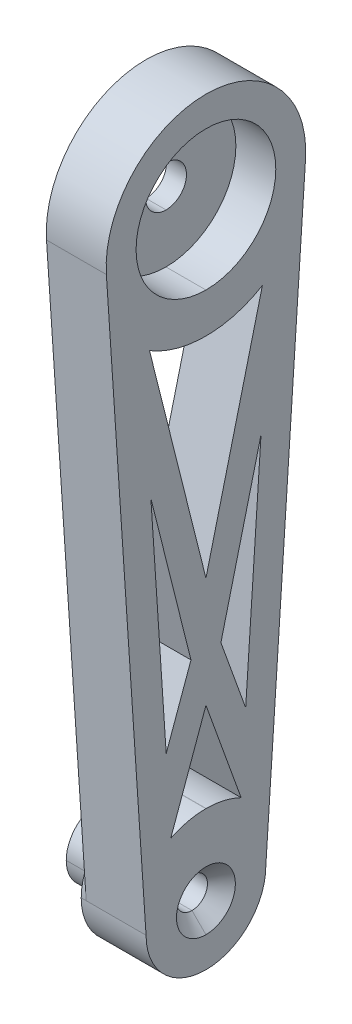
ISO-10303-21;
HEADER;
FILE_DESCRIPTION(('STEP AP214'),'2;1');
FILE_NAME('part.step','',(''),(''),'','','');
FILE_SCHEMA(('AUTOMOTIVE_DESIGN { 1 0 10303 214 1 1 1 1 }'));
ENDSEC;
DATA;
#1=APPLICATION_CONTEXT('core data for automotive mechanical design processes');
#2=APPLICATION_PROTOCOL_DEFINITION('international standard','automotive_design',2000,#1);
#3=PRODUCT_CONTEXT('',#1,'mechanical');
#4=PRODUCT('Part','Part','',(#3));
#5=PRODUCT_RELATED_PRODUCT_CATEGORY('part','',(#4));
#6=PRODUCT_DEFINITION_FORMATION('','',#4);
#7=PRODUCT_DEFINITION_CONTEXT('part definition',#1,'design');
#8=PRODUCT_DEFINITION('design','',#6,#7);
#9=PRODUCT_DEFINITION_SHAPE('','',#8);
#10=(LENGTH_UNIT() NAMED_UNIT(*) SI_UNIT(.MILLI.,.METRE.));
#11=(NAMED_UNIT(*) PLANE_ANGLE_UNIT() SI_UNIT($,.RADIAN.));
#12=(NAMED_UNIT(*) SI_UNIT($,.STERADIAN.) SOLID_ANGLE_UNIT());
#13=UNCERTAINTY_MEASURE_WITH_UNIT(LENGTH_MEASURE(1.E-05),#10,'distance_accuracy_value','');
#14=(GEOMETRIC_REPRESENTATION_CONTEXT(3) GLOBAL_UNCERTAINTY_ASSIGNED_CONTEXT((#13)) GLOBAL_UNIT_ASSIGNED_CONTEXT((#10,
#11,#12)) REPRESENTATION_CONTEXT('',''));
#15=CARTESIAN_POINT('',(0.,0.,0.));
#16=DIRECTION('',(0.,0.,1.));
#17=DIRECTION('',(1.,0.,0.));
#18=AXIS2_PLACEMENT_3D('',#15,#16,#17);
#19=CARTESIAN_POINT('',(0.,0.,0.));
#20=DIRECTION('',(1.,0.,0.));
#21=DIRECTION('',(0.,-1.,0.));
#22=AXIS2_PLACEMENT_3D('',#19,#20,#21);
#23=PLANE('',#22);
#24=DIRECTION('',(0.,-0.997760313354357,-0.066890635331231));
#25=VECTOR('',#24,1.);
#26=CARTESIAN_POINT('',(0.,-0.66890635331231,9.97760313354357));
#27=LINE('',#26,#25);
#28=CARTESIAN_POINT('',(0.,-0.668906353312309,9.97760313354357));
#29=VERTEX_POINT('',#28);
#30=CARTESIAN_POINT('',(0.,-60.,6.));
#31=VERTEX_POINT('',#30);
#32=EDGE_CURVE('E240',#29,#31,#27,.T.);
#33=ORIENTED_EDGE('',*,*,#32,.F.);
#34=CARTESIAN_POINT('',(0.,0.,0.));
#35=DIRECTION('',(1.,0.,0.));
#36=DIRECTION('',(0.,-0.066890635331231,-0.997760313354357));
#37=AXIS2_PLACEMENT_3D('',#34,#35,#36);
#38=CIRCLE('',#37,10.);
#39=CARTESIAN_POINT('',(0.,-0.668906353312309,-9.97760313354357));
#40=VERTEX_POINT('',#39);
#41=EDGE_CURVE('E36',#40,#29,#38,.T.);
#42=ORIENTED_EDGE('',*,*,#41,.F.);
#43=DIRECTION('',(0.,0.997760313354357,-0.066890635331231));
#44=VECTOR('',#43,1.);
#45=CARTESIAN_POINT('',(0.,-60.,-6.));
#46=LINE('',#45,#44);
#47=CARTESIAN_POINT('',(0.,-60.,-6.));
#48=VERTEX_POINT('',#47);
#49=EDGE_CURVE('E341',#48,#40,#46,.T.);
#50=ORIENTED_EDGE('',*,*,#49,.F.);
#51=CARTESIAN_POINT('',(0.,-60.,0.));
#52=DIRECTION('',(-1.,0.,0.));
#53=DIRECTION('',(0.,0.,1.));
#54=AXIS2_PLACEMENT_3D('',#51,#52,#53);
#55=CIRCLE('',#54,6.);
#56=EDGE_CURVE('E403',#31,#48,#55,.T.);
#57=ORIENTED_EDGE('',*,*,#56,.F.);
#58=EDGE_LOOP('',(#33,#42,#50,#57));
#59=FACE_BOUND('',#58,.T.);
#60=DIRECTION('',(0.,-0.997760313354357,-0.0668906353312315));
#61=VECTOR('',#60,1.);
#62=CARTESIAN_POINT('',(0.,-22.3170450758809,5.51956076268863));
#63=LINE('',#62,#61);
#64=CARTESIAN_POINT('',(0.,-22.3170450758809,5.51956076268863));
#65=VERTEX_POINT('',#64);
#66=CARTESIAN_POINT('',(0.,-45.2413588281912,3.98269675747546));
#67=VERTEX_POINT('',#66);
#68=EDGE_CURVE('E11',#65,#67,#63,.T.);
#69=ORIENTED_EDGE('',*,*,#68,.T.);
#70=DIRECTION('',(0.,0.940725836999394,-0.339167951908474));
#71=VECTOR('',#70,1.);
#72=CARTESIAN_POINT('',(0.,-45.2413588281912,3.98269675747546));
#73=LINE('',#72,#71);
#74=CARTESIAN_POINT('',(0.,-38.3552807891257,1.5));
#75=VERTEX_POINT('',#74);
#76=EDGE_CURVE('E27',#67,#75,#73,.T.);
#77=ORIENTED_EDGE('',*,*,#76,.T.);
#78=DIRECTION('',(0.,0.97,0.243104915622865));
#79=VECTOR('',#78,1.);
#80=CARTESIAN_POINT('',(0.,-38.3552807891257,1.5));
#81=LINE('',#80,#79);
#82=EDGE_CURVE('E174',#75,#65,#81,.T.);
#83=ORIENTED_EDGE('',*,*,#82,.T.);
#84=EDGE_LOOP('',(#69,#77,#83));
#85=FACE_BOUND('',#84,.T.);
#86=DIRECTION('',(0.,-0.940725836999394,0.339167951908474));
#87=VECTOR('',#86,1.);
#88=CARTESIAN_POINT('',(0.,-43.0400136347858,0.));
#89=LINE('',#88,#87);
#90=CARTESIAN_POINT('',(0.,-43.0400136347858,0.));
#91=VERTEX_POINT('',#90);
#92=CARTESIAN_POINT('',(0.,-52.8187744648712,3.52562048632773));
#93=VERTEX_POINT('',#92);
#94=EDGE_CURVE('E284',#91,#93,#89,.T.);
#95=ORIENTED_EDGE('',*,*,#94,.T.);
#96=CARTESIAN_POINT('',(0.,-60.,0.));
#97=DIRECTION('',(1.,0.,0.));
#98=DIRECTION('',(0.,0.99999846833785,0.00175023482841359));
#99=AXIS2_PLACEMENT_3D('',#96,#97,#98);
#100=CIRCLE('',#99,7.99999999999991);
#101=CARTESIAN_POINT('',(0.,-52.0000122532972,0.014001878627327));
#102=VERTEX_POINT('',#101);
#103=EDGE_CURVE('E181',#102,#93,#100,.T.);
#104=ORIENTED_EDGE('',*,*,#103,.F.);
#105=DIRECTION('',(0.,0.,-1.));
#106=VECTOR('',#105,1.);
#107=CARTESIAN_POINT('',(0.,-52.0000122532972,0.0140018786273255));
#108=LINE('',#107,#106);
#109=CARTESIAN_POINT('',(0.,-52.0000122532972,-0.014001878627331));
#110=VERTEX_POINT('',#109);
#111=EDGE_CURVE('E281',#102,#110,#108,.T.);
#112=ORIENTED_EDGE('',*,*,#111,.T.);
#113=CARTESIAN_POINT('',(0.,-60.,0.));
#114=DIRECTION('',(1.,0.,0.));
#115=DIRECTION('',(0.,0.897653191891106,-0.44070256079096));
#116=AXIS2_PLACEMENT_3D('',#113,#114,#115);
#117=CIRCLE('',#116,8.00000000000024);
#118=CARTESIAN_POINT('',(0.,-52.8187744648712,-3.52562048632773));
#119=VERTEX_POINT('',#118);
#120=EDGE_CURVE('E340',#119,#110,#117,.T.);
#121=ORIENTED_EDGE('',*,*,#120,.F.);
#122=DIRECTION('',(0.,0.940725836999394,0.339167951908474));
#123=VECTOR('',#122,1.);
#124=CARTESIAN_POINT('',(0.,-52.8187744648712,-3.52562048632773));
#125=LINE('',#124,#123);
#126=EDGE_CURVE('E285',#119,#91,#125,.T.);
#127=ORIENTED_EDGE('',*,*,#126,.T.);
#128=EDGE_LOOP('',(#95,#104,#112,#121,#127));
#129=FACE_BOUND('',#128,.T.);
#130=DIRECTION('',(0.,-0.940725836999394,-0.339167951908474));
#131=VECTOR('',#130,1.);
#132=CARTESIAN_POINT('',(0.,-38.3552807891257,-1.5));
#133=LINE('',#132,#131);
#134=CARTESIAN_POINT('',(0.,-38.3552807891257,-1.5));
#135=VERTEX_POINT('',#134);
#136=CARTESIAN_POINT('',(0.,-45.2413588281912,-3.98269675747546));
#137=VERTEX_POINT('',#136);
#138=EDGE_CURVE('E395',#135,#137,#133,.T.);
#139=ORIENTED_EDGE('',*,*,#138,.T.);
#140=DIRECTION('',(0.,0.997760313354357,-0.0668906353312315));
#141=VECTOR('',#140,1.);
#142=CARTESIAN_POINT('',(0.,-45.2413588281912,-3.98269675747546));
#143=LINE('',#142,#141);
#144=CARTESIAN_POINT('',(0.,-22.3170450758809,-5.51956076268863));
#145=VERTEX_POINT('',#144);
#146=EDGE_CURVE('E399',#137,#145,#143,.T.);
#147=ORIENTED_EDGE('',*,*,#146,.T.);
#148=DIRECTION('',(0.,-0.97,0.243104915622865));
#149=VECTOR('',#148,1.);
#150=CARTESIAN_POINT('',(0.,-22.3170450758809,-5.51956076268863));
#151=LINE('',#150,#149);
#152=EDGE_CURVE('E318',#145,#135,#151,.T.);
#153=ORIENTED_EDGE('',*,*,#152,.T.);
#154=EDGE_LOOP('',(#139,#147,#153));
#155=FACE_BOUND('',#154,.T.);
#156=DIRECTION('',(0.,-0.97,-0.243104915622865));
#157=VECTOR('',#156,1.);
#158=CARTESIAN_POINT('',(0.,-9.43488195511979,5.65535166837173));
#159=LINE('',#158,#157);
#160=CARTESIAN_POINT('',(0.,-9.43488195511979,5.65535166837173));
#161=VERTEX_POINT('',#160);
#162=CARTESIAN_POINT('',(0.,-32.,0.));
#163=VERTEX_POINT('',#162);
#164=EDGE_CURVE('E314',#161,#163,#159,.T.);
#165=ORIENTED_EDGE('',*,*,#164,.T.);
#166=DIRECTION('',(0.,0.97,-0.243104915622865));
#167=VECTOR('',#166,1.);
#168=CARTESIAN_POINT('',(0.,-32.,0.));
#169=LINE('',#168,#167);
#170=CARTESIAN_POINT('',(0.,-9.43488195511979,-5.65535166837173));
#171=VERTEX_POINT('',#170);
#172=EDGE_CURVE('E245',#163,#171,#169,.T.);
#173=ORIENTED_EDGE('',*,*,#172,.T.);
#174=CARTESIAN_POINT('',(0.,0.,0.));
#175=DIRECTION('',(1.,0.,0.));
#176=DIRECTION('',(0.,-0.857716541374527,0.514122878942885));
#177=AXIS2_PLACEMENT_3D('',#174,#175,#176);
#178=CIRCLE('',#177,11.);
#179=EDGE_CURVE('E276',#161,#171,#178,.T.);
#180=ORIENTED_EDGE('',*,*,#179,.F.);
#181=EDGE_LOOP('',(#165,#173,#180));
#182=FACE_BOUND('',#181,.T.);
#183=CARTESIAN_POINT('',(0.,0.,0.));
#184=DIRECTION('',(-1.,0.,0.));
#185=DIRECTION('',(0.,1.,0.));
#186=AXIS2_PLACEMENT_3D('',#183,#184,#185);
#187=CIRCLE('',#186,2.05);
#188=CARTESIAN_POINT('',(0.,2.05,0.));
#189=VERTEX_POINT('',#188);
#190=CARTESIAN_POINT('',(0.,-2.05,0.));
#191=VERTEX_POINT('',#190);
#192=EDGE_CURVE('E280',#189,#191,#187,.T.);
#193=ORIENTED_EDGE('',*,*,#192,.F.);
#194=CARTESIAN_POINT('',(0.,0.,0.));
#195=DIRECTION('',(-1.,0.,0.));
#196=DIRECTION('',(0.,-1.,0.));
#197=AXIS2_PLACEMENT_3D('',#194,#195,#196);
#198=CIRCLE('',#197,2.05);
#199=EDGE_CURVE('E406',#191,#189,#198,.T.);
#200=ORIENTED_EDGE('',*,*,#199,.F.);
#201=EDGE_LOOP('',(#193,#200));
#202=FACE_BOUND('',#201,.T.);
#203=ADVANCED_FACE('F16',(#59,#85,#129,#155,#182,#202),#23,.F.);
#204=CARTESIAN_POINT('',(0.,-0.668906353312309,9.97760313354357));
#205=DIRECTION('',(0.,-0.066890635331231,0.997760313354357));
#206=DIRECTION('',(0.,-0.997760313354357,-0.066890635331231));
#207=AXIS2_PLACEMENT_3D('',#204,#205,#206);
#208=PLANE('',#207);
#209=DIRECTION('',(1.,0.,0.));
#210=VECTOR('',#209,1.);
#211=CARTESIAN_POINT('',(0.,-60.,6.));
#212=LINE('',#211,#210);
#213=CARTESIAN_POINT('',(6.,-60.,6.));
#214=VERTEX_POINT('',#213);
#215=EDGE_CURVE('E238',#31,#214,#212,.T.);
#216=ORIENTED_EDGE('',*,*,#215,.T.);
#217=DIRECTION('',(0.,-0.997760313354357,-0.066890635331231));
#218=VECTOR('',#217,1.);
#219=CARTESIAN_POINT('',(6.,-0.66890635331231,9.97760313354357));
#220=LINE('',#219,#218);
#221=CARTESIAN_POINT('',(6.,-0.668906353312309,9.97760313354357));
#222=VERTEX_POINT('',#221);
#223=EDGE_CURVE('E225',#222,#214,#220,.T.);
#224=ORIENTED_EDGE('',*,*,#223,.F.);
#225=DIRECTION('',(1.,0.,0.));
#226=VECTOR('',#225,1.);
#227=CARTESIAN_POINT('',(0.,-0.668906353312309,9.97760313354357));
#228=LINE('',#227,#226);
#229=EDGE_CURVE('E294',#29,#222,#228,.T.);
#230=ORIENTED_EDGE('',*,*,#229,.F.);
#231=ORIENTED_EDGE('',*,*,#32,.T.);
#232=EDGE_LOOP('',(#216,#224,#230,#231));
#233=FACE_BOUND('',#232,.T.);
#234=ADVANCED_FACE('F239',(#233),#208,.T.);
#235=CARTESIAN_POINT('',(0.,0.,0.));
#236=DIRECTION('',(-1.,0.,0.));
#237=DIRECTION('',(0.,-1.,0.));
#238=AXIS2_PLACEMENT_3D('',#235,#236,#237);
#239=CYLINDRICAL_SURFACE('',#238,10.);
#240=ORIENTED_EDGE('',*,*,#229,.T.);
#241=CARTESIAN_POINT('',(6.,0.,0.));
#242=DIRECTION('',(1.,0.,0.));
#243=DIRECTION('',(0.,-0.066890635331231,-0.997760313354357));
#244=AXIS2_PLACEMENT_3D('',#241,#242,#243);
#245=CIRCLE('',#244,10.);
#246=CARTESIAN_POINT('',(6.,-0.668906353312309,-9.97760313354357));
#247=VERTEX_POINT('',#246);
#248=EDGE_CURVE('E231',#247,#222,#245,.T.);
#249=ORIENTED_EDGE('',*,*,#248,.F.);
#250=DIRECTION('',(1.,0.,0.));
#251=VECTOR('',#250,1.);
#252=CARTESIAN_POINT('',(0.,-0.668906353312309,-9.97760313354357));
#253=LINE('',#252,#251);
#254=EDGE_CURVE('E344',#40,#247,#253,.T.);
#255=ORIENTED_EDGE('',*,*,#254,.F.);
#256=ORIENTED_EDGE('',*,*,#41,.T.);
#257=EDGE_LOOP('',(#240,#249,#255,#256));
#258=FACE_BOUND('',#257,.T.);
#259=ADVANCED_FACE('F584',(#258),#239,.T.);
#260=CARTESIAN_POINT('',(0.,-60.,-6.));
#261=DIRECTION('',(0.,-0.066890635331231,-0.997760313354357));
#262=DIRECTION('',(0.,0.997760313354357,-0.066890635331231));
#263=AXIS2_PLACEMENT_3D('',#260,#261,#262);
#264=PLANE('',#263);
#265=ORIENTED_EDGE('',*,*,#254,.T.);
#266=DIRECTION('',(0.,0.997760313354357,-0.066890635331231));
#267=VECTOR('',#266,1.);
#268=CARTESIAN_POINT('',(6.,-60.,-6.));
#269=LINE('',#268,#267);
#270=CARTESIAN_POINT('',(6.,-60.,-6.));
#271=VERTEX_POINT('',#270);
#272=EDGE_CURVE('E252',#271,#247,#269,.T.);
#273=ORIENTED_EDGE('',*,*,#272,.F.);
#274=DIRECTION('',(1.,0.,0.));
#275=VECTOR('',#274,1.);
#276=CARTESIAN_POINT('',(0.,-60.,-6.));
#277=LINE('',#276,#275);
#278=EDGE_CURVE('E250',#48,#271,#277,.T.);
#279=ORIENTED_EDGE('',*,*,#278,.F.);
#280=ORIENTED_EDGE('',*,*,#49,.T.);
#281=EDGE_LOOP('',(#265,#273,#279,#280));
#282=FACE_BOUND('',#281,.T.);
#283=ADVANCED_FACE('F582',(#282),#264,.T.);
#284=CARTESIAN_POINT('',(0.,-60.,0.));
#285=DIRECTION('',(1.,0.,0.));
#286=DIRECTION('',(0.,0.,-1.));
#287=AXIS2_PLACEMENT_3D('',#284,#285,#286);
#288=CYLINDRICAL_SURFACE('',#287,6.);
#289=DIRECTION('',(-1.,0.,0.));
#290=VECTOR('',#289,1.);
#291=CARTESIAN_POINT('',(0.,-60.,-6.));
#292=LINE('',#291,#290);
#293=CARTESIAN_POINT('',(-0.5,-60.,-6.));
#294=VERTEX_POINT('',#293);
#295=EDGE_CURVE('E345',#48,#294,#292,.T.);
#296=ORIENTED_EDGE('',*,*,#295,.T.);
#297=CARTESIAN_POINT('',(-0.5,-60.,0.));
#298=DIRECTION('',(-1.,0.,0.));
#299=DIRECTION('',(0.,0.,1.));
#300=AXIS2_PLACEMENT_3D('',#297,#298,#299);
#301=CIRCLE('',#300,6.);
#302=CARTESIAN_POINT('',(-0.5,-60.,6.));
#303=VERTEX_POINT('',#302);
#304=EDGE_CURVE('E258',#303,#294,#301,.T.);
#305=ORIENTED_EDGE('',*,*,#304,.F.);
#306=DIRECTION('',(-1.,0.,0.));
#307=VECTOR('',#306,1.);
#308=CARTESIAN_POINT('',(0.,-60.,6.));
#309=LINE('',#308,#307);
#310=EDGE_CURVE('E324',#31,#303,#309,.T.);
#311=ORIENTED_EDGE('',*,*,#310,.F.);
#312=ORIENTED_EDGE('',*,*,#56,.T.);
#313=EDGE_LOOP('',(#296,#305,#311,#312));
#314=FACE_BOUND('',#313,.T.);
#315=ADVANCED_FACE('F592',(#314),#288,.T.);
#316=CARTESIAN_POINT('',(6.,-22.3170450758809,5.51956076268863));
#317=DIRECTION('',(0.,-0.0668906353312315,0.997760313354357));
#318=DIRECTION('',(0.,-0.997760313354357,-0.0668906353312315));
#319=AXIS2_PLACEMENT_3D('',#316,#317,#318);
#320=PLANE('',#319);
#321=DIRECTION('',(-1.,0.,0.));
#322=VECTOR('',#321,1.);
#323=CARTESIAN_POINT('',(6.,-22.3170450758809,5.51956076268863));
#324=LINE('',#323,#322);
#325=CARTESIAN_POINT('',(6.,-22.3170450758809,5.51956076268863));
#326=VERTEX_POINT('',#325);
#327=EDGE_CURVE('E275',#326,#65,#324,.T.);
#328=ORIENTED_EDGE('',*,*,#327,.F.);
#329=DIRECTION('',(0.,-0.997760313354357,-0.0668906353312315));
#330=VECTOR('',#329,1.);
#331=CARTESIAN_POINT('',(6.,-22.3170450758809,5.51956076268863));
#332=LINE('',#331,#330);
#333=CARTESIAN_POINT('',(6.,-45.2413588281912,3.98269675747546));
#334=VERTEX_POINT('',#333);
#335=EDGE_CURVE('E409',#326,#334,#332,.T.);
#336=ORIENTED_EDGE('',*,*,#335,.T.);
#337=DIRECTION('',(-1.,0.,0.));
#338=VECTOR('',#337,1.);
#339=CARTESIAN_POINT('',(6.,-45.2413588281912,3.98269675747546));
#340=LINE('',#339,#338);
#341=EDGE_CURVE('E383',#334,#67,#340,.T.);
#342=ORIENTED_EDGE('',*,*,#341,.T.);
#343=ORIENTED_EDGE('',*,*,#68,.F.);
#344=EDGE_LOOP('',(#328,#336,#342,#343));
#345=FACE_BOUND('',#344,.T.);
#346=ADVANCED_FACE('F664',(#345),#320,.F.);
#347=CARTESIAN_POINT('',(6.,-45.2413588281912,3.98269675747546));
#348=DIRECTION('',(0.,-0.339167951908474,-0.940725836999394));
#349=DIRECTION('',(0.,0.940725836999394,-0.339167951908474));
#350=AXIS2_PLACEMENT_3D('',#347,#348,#349);
#351=PLANE('',#350);
#352=ORIENTED_EDGE('',*,*,#341,.F.);
#353=DIRECTION('',(0.,0.940725836999394,-0.339167951908474));
#354=VECTOR('',#353,1.);
#355=CARTESIAN_POINT('',(6.,-45.2413588281912,3.98269675747546));
#356=LINE('',#355,#354);
#357=CARTESIAN_POINT('',(6.,-38.3552807891257,1.5));
#358=VERTEX_POINT('',#357);
#359=EDGE_CURVE('E274',#334,#358,#356,.T.);
#360=ORIENTED_EDGE('',*,*,#359,.T.);
#361=DIRECTION('',(-1.,0.,0.));
#362=VECTOR('',#361,1.);
#363=CARTESIAN_POINT('',(6.,-38.3552807891257,1.5));
#364=LINE('',#363,#362);
#365=EDGE_CURVE('E270',#358,#75,#364,.T.);
#366=ORIENTED_EDGE('',*,*,#365,.T.);
#367=ORIENTED_EDGE('',*,*,#76,.F.);
#368=EDGE_LOOP('',(#352,#360,#366,#367));
#369=FACE_BOUND('',#368,.T.);
#370=ADVANCED_FACE('F626',(#369),#351,.F.);
#371=CARTESIAN_POINT('',(6.,-32.7293147468686,2.91));
#372=DIRECTION('',(0.,0.243104915622865,-0.97));
#373=DIRECTION('',(0.,0.97,0.243104915622865));
#374=AXIS2_PLACEMENT_3D('',#371,#372,#373);
#375=PLANE('',#374);
#376=ORIENTED_EDGE('',*,*,#327,.T.);
#377=ORIENTED_EDGE('',*,*,#82,.F.);
#378=ORIENTED_EDGE('',*,*,#365,.F.);
#379=DIRECTION('',(0.,-0.97,-0.243104915622865));
#380=VECTOR('',#379,1.);
#381=CARTESIAN_POINT('',(6.,-22.3170450758809,5.51956076268864));
#382=LINE('',#381,#380);
#383=EDGE_CURVE('E386',#326,#358,#382,.T.);
#384=ORIENTED_EDGE('',*,*,#383,.F.);
#385=EDGE_LOOP('',(#376,#377,#378,#384));
#386=FACE_BOUND('',#385,.T.);
#387=ADVANCED_FACE('F622',(#386),#375,.F.);
#388=CARTESIAN_POINT('',(6.,-43.0400136347858,0.));
#389=DIRECTION('',(0.,0.339167951908474,0.940725836999394));
#390=DIRECTION('',(0.,-0.940725836999394,0.339167951908474));
#391=AXIS2_PLACEMENT_3D('',#388,#389,#390);
#392=PLANE('',#391);
#393=DIRECTION('',(-1.,0.,0.));
#394=VECTOR('',#393,1.);
#395=CARTESIAN_POINT('',(6.,-43.0400136347858,0.));
#396=LINE('',#395,#394);
#397=CARTESIAN_POINT('',(6.,-43.0400136347858,0.));
#398=VERTEX_POINT('',#397);
#399=EDGE_CURVE('E20',#398,#91,#396,.T.);
#400=ORIENTED_EDGE('',*,*,#399,.F.);
#401=DIRECTION('',(0.,-0.940725836999394,0.339167951908474));
#402=VECTOR('',#401,1.);
#403=CARTESIAN_POINT('',(6.,-43.0400136347858,0.));
#404=LINE('',#403,#402);
#405=CARTESIAN_POINT('',(6.,-52.8187744648712,3.52562048632773));
#406=VERTEX_POINT('',#405);
#407=EDGE_CURVE('E378',#398,#406,#404,.T.);
#408=ORIENTED_EDGE('',*,*,#407,.T.);
#409=DIRECTION('',(-1.,0.,0.));
#410=VECTOR('',#409,1.);
#411=CARTESIAN_POINT('',(6.,-52.8187744648712,3.52562048632774));
#412=LINE('',#411,#410);
#413=EDGE_CURVE('E374',#406,#93,#412,.T.);
#414=ORIENTED_EDGE('',*,*,#413,.T.);
#415=ORIENTED_EDGE('',*,*,#94,.F.);
#416=EDGE_LOOP('',(#400,#408,#414,#415));
#417=FACE_BOUND('',#416,.T.);
#418=ADVANCED_FACE('F625',(#417),#392,.F.);
#419=CARTESIAN_POINT('',(6.,-60.,0.));
#420=DIRECTION('',(-1.,0.,0.));
#421=DIRECTION('',(0.,-1.,0.));
#422=AXIS2_PLACEMENT_3D('',#419,#420,#421);
#423=CYLINDRICAL_SURFACE('',#422,8.);
#424=ORIENTED_EDGE('',*,*,#413,.F.);
#425=CARTESIAN_POINT('',(6.,-60.,0.));
#426=DIRECTION('',(1.,0.,0.));
#427=DIRECTION('',(0.,0.99999846833785,0.00175023482841359));
#428=AXIS2_PLACEMENT_3D('',#425,#426,#427);
#429=CIRCLE('',#428,7.99999999999991);
#430=CARTESIAN_POINT('',(6.,-52.0000122532972,0.014001878627327));
#431=VERTEX_POINT('',#430);
#432=EDGE_CURVE('E299',#431,#406,#429,.T.);
#433=ORIENTED_EDGE('',*,*,#432,.F.);
#434=DIRECTION('',(-1.,0.,0.));
#435=VECTOR('',#434,1.);
#436=CARTESIAN_POINT('',(6.,-52.0000122532972,0.01400187862733));
#437=LINE('',#436,#435);
#438=EDGE_CURVE('E379',#431,#102,#437,.T.);
#439=ORIENTED_EDGE('',*,*,#438,.T.);
#440=ORIENTED_EDGE('',*,*,#103,.T.);
#441=EDGE_LOOP('',(#424,#433,#439,#440));
#442=FACE_BOUND('',#441,.T.);
#443=ADVANCED_FACE('F641',(#442),#423,.T.);
#444=CARTESIAN_POINT('',(6.,-52.0000122532972,0.01400187862733));
#445=DIRECTION('',(0.,-1.,0.));
#446=DIRECTION('',(0.,0.,-1.));
#447=AXIS2_PLACEMENT_3D('',#444,#445,#446);
#448=PLANE('',#447);
#449=ORIENTED_EDGE('',*,*,#438,.F.);
#450=DIRECTION('',(0.,0.,-1.));
#451=VECTOR('',#450,1.);
#452=CARTESIAN_POINT('',(6.,-52.0000122532972,0.0140018786273255));
#453=LINE('',#452,#451);
#454=CARTESIAN_POINT('',(6.,-52.0000122532972,-0.014001878627331));
#455=VERTEX_POINT('',#454);
#456=EDGE_CURVE('E430',#431,#455,#453,.T.);
#457=ORIENTED_EDGE('',*,*,#456,.T.);
#458=DIRECTION('',(-1.,0.,0.));
#459=VECTOR('',#458,1.);
#460=CARTESIAN_POINT('',(6.,-52.0000122532972,-0.014001878627331));
#461=LINE('',#460,#459);
#462=EDGE_CURVE('E426',#455,#110,#461,.T.);
#463=ORIENTED_EDGE('',*,*,#462,.T.);
#464=ORIENTED_EDGE('',*,*,#111,.F.);
#465=EDGE_LOOP('',(#449,#457,#463,#464));
#466=FACE_BOUND('',#465,.T.);
#467=ADVANCED_FACE('F632',(#466),#448,.F.);
#468=CARTESIAN_POINT('',(6.,-60.,0.));
#469=DIRECTION('',(-1.,0.,0.));
#470=DIRECTION('',(0.,-1.,0.));
#471=AXIS2_PLACEMENT_3D('',#468,#469,#470);
#472=CYLINDRICAL_SURFACE('',#471,8.);
#473=ORIENTED_EDGE('',*,*,#462,.F.);
#474=CARTESIAN_POINT('',(6.,-60.,0.));
#475=DIRECTION('',(1.,0.,0.));
#476=DIRECTION('',(0.,0.897653191891106,-0.44070256079096));
#477=AXIS2_PLACEMENT_3D('',#474,#475,#476);
#478=CIRCLE('',#477,8.00000000000024);
#479=CARTESIAN_POINT('',(6.,-52.8187744648712,-3.52562048632773));
#480=VERTEX_POINT('',#479);
#481=EDGE_CURVE('E442',#480,#455,#478,.T.);
#482=ORIENTED_EDGE('',*,*,#481,.F.);
#483=DIRECTION('',(-1.,0.,0.));
#484=VECTOR('',#483,1.);
#485=CARTESIAN_POINT('',(6.,-52.8187744648712,-3.52562048632773));
#486=LINE('',#485,#484);
#487=EDGE_CURVE('E357',#480,#119,#486,.T.);
#488=ORIENTED_EDGE('',*,*,#487,.T.);
#489=ORIENTED_EDGE('',*,*,#120,.T.);
#490=EDGE_LOOP('',(#473,#482,#488,#489));
#491=FACE_BOUND('',#490,.T.);
#492=ADVANCED_FACE('F628',(#491),#472,.T.);
#493=CARTESIAN_POINT('',(6.,-52.8187744648712,-3.52562048632773));
#494=DIRECTION('',(0.,0.339167951908474,-0.940725836999395));
#495=DIRECTION('',(0.,0.940725836999395,0.339167951908474));
#496=AXIS2_PLACEMENT_3D('',#493,#494,#495);
#497=PLANE('',#496);
#498=ORIENTED_EDGE('',*,*,#487,.F.);
#499=DIRECTION('',(0.,0.940725836999394,0.339167951908474));
#500=VECTOR('',#499,1.);
#501=CARTESIAN_POINT('',(6.,-52.8187744648712,-3.52562048632773));
#502=LINE('',#501,#500);
#503=EDGE_CURVE('E336',#480,#398,#502,.T.);
#504=ORIENTED_EDGE('',*,*,#503,.T.);
#505=ORIENTED_EDGE('',*,*,#399,.T.);
#506=ORIENTED_EDGE('',*,*,#126,.F.);
#507=EDGE_LOOP('',(#498,#504,#505,#506));
#508=FACE_BOUND('',#507,.T.);
#509=ADVANCED_FACE('F631',(#508),#497,.F.);
#510=CARTESIAN_POINT('',(6.,-38.3552807891257,-1.5));
#511=DIRECTION('',(0.,-0.339167951908474,0.940725836999394));
#512=DIRECTION('',(0.,-0.940725836999394,-0.339167951908474));
#513=AXIS2_PLACEMENT_3D('',#510,#511,#512);
#514=PLANE('',#513);
#515=DIRECTION('',(-1.,0.,0.));
#516=VECTOR('',#515,1.);
#517=CARTESIAN_POINT('',(6.,-38.3552807891257,-1.5));
#518=LINE('',#517,#516);
#519=CARTESIAN_POINT('',(6.,-38.3552807891257,-1.5));
#520=VERTEX_POINT('',#519);
#521=EDGE_CURVE('E468',#520,#135,#518,.T.);
#522=ORIENTED_EDGE('',*,*,#521,.F.);
#523=DIRECTION('',(0.,-0.940725836999394,-0.339167951908474));
#524=VECTOR('',#523,1.);
#525=CARTESIAN_POINT('',(6.,-38.3552807891257,-1.5));
#526=LINE('',#525,#524);
#527=CARTESIAN_POINT('',(6.,-45.2413588281912,-3.98269675747546));
#528=VERTEX_POINT('',#527);
#529=EDGE_CURVE('E287',#520,#528,#526,.T.);
#530=ORIENTED_EDGE('',*,*,#529,.T.);
#531=DIRECTION('',(-1.,0.,0.));
#532=VECTOR('',#531,1.);
#533=CARTESIAN_POINT('',(6.,-45.2413588281912,-3.98269675747546));
#534=LINE('',#533,#532);
#535=EDGE_CURVE('E291',#528,#137,#534,.T.);
#536=ORIENTED_EDGE('',*,*,#535,.T.);
#537=ORIENTED_EDGE('',*,*,#138,.F.);
#538=EDGE_LOOP('',(#522,#530,#536,#537));
#539=FACE_BOUND('',#538,.T.);
#540=ADVANCED_FACE('F610',(#539),#514,.F.);
#541=CARTESIAN_POINT('',(6.,-45.2413588281912,-3.98269675747546));
#542=DIRECTION('',(0.,-0.0668906353312315,-0.997760313354357));
#543=DIRECTION('',(0.,0.997760313354357,-0.0668906353312315));
#544=AXIS2_PLACEMENT_3D('',#541,#542,#543);
#545=PLANE('',#544);
#546=ORIENTED_EDGE('',*,*,#535,.F.);
#547=DIRECTION('',(0.,0.997760313354357,-0.0668906353312315));
#548=VECTOR('',#547,1.);
#549=CARTESIAN_POINT('',(6.,-45.2413588281912,-3.98269675747546));
#550=LINE('',#549,#548);
#551=CARTESIAN_POINT('',(6.,-22.3170450758809,-5.51956076268863));
#552=VERTEX_POINT('',#551);
#553=EDGE_CURVE('E474',#528,#552,#550,.T.);
#554=ORIENTED_EDGE('',*,*,#553,.T.);
#555=DIRECTION('',(-1.,0.,0.));
#556=VECTOR('',#555,1.);
#557=CARTESIAN_POINT('',(6.,-22.3170450758809,-5.51956076268863));
#558=LINE('',#557,#556);
#559=EDGE_CURVE('E478',#552,#145,#558,.T.);
#560=ORIENTED_EDGE('',*,*,#559,.T.);
#561=ORIENTED_EDGE('',*,*,#146,.F.);
#562=EDGE_LOOP('',(#546,#554,#560,#561));
#563=FACE_BOUND('',#562,.T.);
#564=ADVANCED_FACE('F606',(#563),#545,.F.);
#565=CARTESIAN_POINT('',(6.,-32.7293147468686,-2.91));
#566=DIRECTION('',(0.,0.243104915622865,0.97));
#567=DIRECTION('',(0.,-0.97,0.243104915622865));
#568=AXIS2_PLACEMENT_3D('',#565,#566,#567);
#569=PLANE('',#568);
#570=ORIENTED_EDGE('',*,*,#521,.T.);
#571=ORIENTED_EDGE('',*,*,#152,.F.);
#572=ORIENTED_EDGE('',*,*,#559,.F.);
#573=DIRECTION('',(0.,0.97,-0.243104915622865));
#574=VECTOR('',#573,1.);
#575=CARTESIAN_POINT('',(6.,-38.3552807891257,-1.5));
#576=LINE('',#575,#574);
#577=EDGE_CURVE('E295',#520,#552,#576,.T.);
#578=ORIENTED_EDGE('',*,*,#577,.F.);
#579=EDGE_LOOP('',(#570,#571,#572,#578));
#580=FACE_BOUND('',#579,.T.);
#581=ADVANCED_FACE('F609',(#580),#569,.F.);
#582=CARTESIAN_POINT('',(6.,-9.43488195511979,5.65535166837173));
#583=DIRECTION('',(0.,-0.243104915622865,0.97));
#584=DIRECTION('',(0.,-0.97,-0.243104915622865));
#585=AXIS2_PLACEMENT_3D('',#582,#583,#584);
#586=PLANE('',#585);
#587=DIRECTION('',(-1.,0.,0.));
#588=VECTOR('',#587,1.);
#589=CARTESIAN_POINT('',(6.,-9.43488195511979,5.65535166837173));
#590=LINE('',#589,#588);
#591=CARTESIAN_POINT('',(6.,-9.43488195511979,5.65535166837173));
#592=VERTEX_POINT('',#591);
#593=EDGE_CURVE('E279',#592,#161,#590,.T.);
#594=ORIENTED_EDGE('',*,*,#593,.F.);
#595=DIRECTION('',(0.,-0.97,-0.243104915622865));
#596=VECTOR('',#595,1.);
#597=CARTESIAN_POINT('',(6.,-9.43488195511979,5.65535166837173));
#598=LINE('',#597,#596);
#599=CARTESIAN_POINT('',(6.,-32.,0.));
#600=VERTEX_POINT('',#599);
#601=EDGE_CURVE('E464',#592,#600,#598,.T.);
#602=ORIENTED_EDGE('',*,*,#601,.T.);
#603=DIRECTION('',(-1.,0.,0.));
#604=VECTOR('',#603,1.);
#605=CARTESIAN_POINT('',(6.,-32.,0.));
#606=LINE('',#605,#604);
#607=EDGE_CURVE('E390',#600,#163,#606,.T.);
#608=ORIENTED_EDGE('',*,*,#607,.T.);
#609=ORIENTED_EDGE('',*,*,#164,.F.);
#610=EDGE_LOOP('',(#594,#602,#608,#609));
#611=FACE_BOUND('',#610,.T.);
#612=ADVANCED_FACE('F637',(#611),#586,.F.);
#613=CARTESIAN_POINT('',(6.,-32.,0.));
#614=DIRECTION('',(0.,-0.243104915622865,-0.97));
#615=DIRECTION('',(0.,0.97,-0.243104915622865));
#616=AXIS2_PLACEMENT_3D('',#613,#614,#615);
#617=PLANE('',#616);
#618=ORIENTED_EDGE('',*,*,#607,.F.);
#619=DIRECTION('',(0.,0.97,-0.243104915622865));
#620=VECTOR('',#619,1.);
#621=CARTESIAN_POINT('',(6.,-32.,0.));
#622=LINE('',#621,#620);
#623=CARTESIAN_POINT('',(6.,-9.43488195511979,-5.65535166837173));
#624=VERTEX_POINT('',#623);
#625=EDGE_CURVE('E329',#600,#624,#622,.T.);
#626=ORIENTED_EDGE('',*,*,#625,.T.);
#627=DIRECTION('',(-1.,0.,0.));
#628=VECTOR('',#627,1.);
#629=CARTESIAN_POINT('',(6.,-9.43488195511979,-5.65535166837173));
#630=LINE('',#629,#628);
#631=EDGE_CURVE('E325',#624,#171,#630,.T.);
#632=ORIENTED_EDGE('',*,*,#631,.T.);
#633=ORIENTED_EDGE('',*,*,#172,.F.);
#634=EDGE_LOOP('',(#618,#626,#632,#633));
#635=FACE_BOUND('',#634,.T.);
#636=ADVANCED_FACE('F634',(#635),#617,.F.);
#637=CARTESIAN_POINT('',(6.,0.,0.));
#638=DIRECTION('',(-1.,0.,0.));
#639=DIRECTION('',(0.,-1.,0.));
#640=AXIS2_PLACEMENT_3D('',#637,#638,#639);
#641=CYLINDRICAL_SURFACE('',#640,11.);
#642=ORIENTED_EDGE('',*,*,#631,.F.);
#643=CARTESIAN_POINT('',(6.,0.,0.));
#644=DIRECTION('',(1.,0.,0.));
#645=DIRECTION('',(0.,-0.857716541374527,0.514122878942885));
#646=AXIS2_PLACEMENT_3D('',#643,#644,#645);
#647=CIRCLE('',#646,11.);
#648=EDGE_CURVE('E300',#592,#624,#647,.T.);
#649=ORIENTED_EDGE('',*,*,#648,.F.);
#650=ORIENTED_EDGE('',*,*,#593,.T.);
#651=ORIENTED_EDGE('',*,*,#179,.T.);
#652=EDGE_LOOP('',(#642,#649,#650,#651));
#653=FACE_BOUND('',#652,.T.);
#654=ADVANCED_FACE('F18',(#653),#641,.T.);
#655=CARTESIAN_POINT('',(0.,0.,0.));
#656=DIRECTION('',(-1.,0.,0.));
#657=DIRECTION('',(0.,-1.,0.));
#658=AXIS2_PLACEMENT_3D('',#655,#656,#657);
#659=CYLINDRICAL_SURFACE('',#658,2.05);
#660=DIRECTION('',(1.,0.,0.));
#661=VECTOR('',#660,1.);
#662=CARTESIAN_POINT('',(0.,2.05,0.));
#663=LINE('',#662,#661);
#664=CARTESIAN_POINT('',(2.,2.05,0.));
#665=VERTEX_POINT('',#664);
#666=EDGE_CURVE('E323',#189,#665,#663,.T.);
#667=ORIENTED_EDGE('',*,*,#666,.F.);
#668=ORIENTED_EDGE('',*,*,#192,.T.);
#669=DIRECTION('',(1.,0.,0.));
#670=VECTOR('',#669,1.);
#671=CARTESIAN_POINT('',(0.,-2.05,0.));
#672=LINE('',#671,#670);
#673=CARTESIAN_POINT('',(2.,-2.05,0.));
#674=VERTEX_POINT('',#673);
#675=EDGE_CURVE('E301',#191,#674,#672,.T.);
#676=ORIENTED_EDGE('',*,*,#675,.T.);
#677=CARTESIAN_POINT('',(2.,0.,0.));
#678=DIRECTION('',(1.,0.,0.));
#679=DIRECTION('',(0.,-1.,0.));
#680=AXIS2_PLACEMENT_3D('',#677,#678,#679);
#681=CIRCLE('',#680,2.05);
#682=EDGE_CURVE('E305',#674,#665,#681,.T.);
#683=ORIENTED_EDGE('',*,*,#682,.T.);
#684=EDGE_LOOP('',(#667,#668,#676,#683));
#685=FACE_BOUND('',#684,.T.);
#686=ADVANCED_FACE('F612',(#685),#659,.F.);
#687=CARTESIAN_POINT('',(0.,0.,0.));
#688=DIRECTION('',(-1.,0.,0.));
#689=DIRECTION('',(0.,-1.,0.));
#690=AXIS2_PLACEMENT_3D('',#687,#688,#689);
#691=CYLINDRICAL_SURFACE('',#690,2.05);
#692=ORIENTED_EDGE('',*,*,#675,.F.);
#693=ORIENTED_EDGE('',*,*,#199,.T.);
#694=ORIENTED_EDGE('',*,*,#666,.T.);
#695=CARTESIAN_POINT('',(2.,0.,0.));
#696=DIRECTION('',(1.,0.,0.));
#697=DIRECTION('',(0.,1.,0.));
#698=AXIS2_PLACEMENT_3D('',#695,#696,#697);
#699=CIRCLE('',#698,2.05);
#700=EDGE_CURVE('E319',#665,#674,#699,.T.);
#701=ORIENTED_EDGE('',*,*,#700,.T.);
#702=EDGE_LOOP('',(#692,#693,#694,#701));
#703=FACE_BOUND('',#702,.T.);
#704=ADVANCED_FACE('F615',(#703),#691,.F.);
#705=CARTESIAN_POINT('',(0.,-60.,0.));
#706=DIRECTION('',(-1.,0.,0.));
#707=DIRECTION('',(0.,-1.,0.));
#708=AXIS2_PLACEMENT_3D('',#705,#706,#707);
#709=CYLINDRICAL_SURFACE('',#708,6.);
#710=CARTESIAN_POINT('',(6.,-60.,0.));
#711=DIRECTION('',(1.,0.,0.));
#712=DIRECTION('',(0.,0.,1.));
#713=AXIS2_PLACEMENT_3D('',#710,#711,#712);
#714=CIRCLE('',#713,6.);
#715=EDGE_CURVE('E230',#214,#271,#714,.T.);
#716=ORIENTED_EDGE('',*,*,#715,.F.);
#717=ORIENTED_EDGE('',*,*,#215,.F.);
#718=ORIENTED_EDGE('',*,*,#310,.T.);
#719=CARTESIAN_POINT('',(-0.5,-60.,0.));
#720=DIRECTION('',(-1.,0.,0.));
#721=DIRECTION('',(0.,0.,-1.));
#722=AXIS2_PLACEMENT_3D('',#719,#720,#721);
#723=CIRCLE('',#722,6.);
#724=EDGE_CURVE('E373',#294,#303,#723,.T.);
#725=ORIENTED_EDGE('',*,*,#724,.F.);
#726=ORIENTED_EDGE('',*,*,#295,.F.);
#727=ORIENTED_EDGE('',*,*,#278,.T.);
#728=EDGE_LOOP('',(#716,#717,#718,#725,#726,#727));
#729=FACE_BOUND('',#728,.T.);
#730=ADVANCED_FACE('F248',(#729),#709,.T.);
#731=CARTESIAN_POINT('',(6.,0.,0.));
#732=DIRECTION('',(1.,0.,0.));
#733=DIRECTION('',(0.,-1.,0.));
#734=AXIS2_PLACEMENT_3D('',#731,#732,#733);
#735=PLANE('',#734);
#736=ORIENTED_EDGE('',*,*,#359,.F.);
#737=ORIENTED_EDGE('',*,*,#335,.F.);
#738=ORIENTED_EDGE('',*,*,#383,.T.);
#739=EDGE_LOOP('',(#736,#737,#738));
#740=FACE_BOUND('',#739,.T.);
#741=ORIENTED_EDGE('',*,*,#481,.T.);
#742=ORIENTED_EDGE('',*,*,#456,.F.);
#743=ORIENTED_EDGE('',*,*,#432,.T.);
#744=ORIENTED_EDGE('',*,*,#407,.F.);
#745=ORIENTED_EDGE('',*,*,#503,.F.);
#746=EDGE_LOOP('',(#741,#742,#743,#744,#745));
#747=FACE_BOUND('',#746,.T.);
#748=ORIENTED_EDGE('',*,*,#553,.F.);
#749=ORIENTED_EDGE('',*,*,#529,.F.);
#750=ORIENTED_EDGE('',*,*,#577,.T.);
#751=EDGE_LOOP('',(#748,#749,#750));
#752=FACE_BOUND('',#751,.T.);
#753=ORIENTED_EDGE('',*,*,#625,.F.);
#754=ORIENTED_EDGE('',*,*,#601,.F.);
#755=ORIENTED_EDGE('',*,*,#648,.T.);
#756=EDGE_LOOP('',(#753,#754,#755));
#757=FACE_BOUND('',#756,.T.);
#758=CARTESIAN_POINT('',(6.,0.,0.));
#759=DIRECTION('',(1.,0.,0.));
#760=DIRECTION('',(0.,1.,0.));
#761=AXIS2_PLACEMENT_3D('',#758,#759,#760);
#762=CIRCLE('',#761,7.);
#763=CARTESIAN_POINT('',(6.,7.,0.));
#764=VERTEX_POINT('',#763);
#765=CARTESIAN_POINT('',(6.,-7.,0.));
#766=VERTEX_POINT('',#765);
#767=EDGE_CURVE('E330',#764,#766,#762,.T.);
#768=ORIENTED_EDGE('',*,*,#767,.F.);
#769=CARTESIAN_POINT('',(6.,0.,0.));
#770=DIRECTION('',(1.,0.,0.));
#771=DIRECTION('',(0.,-1.,0.));
#772=AXIS2_PLACEMENT_3D('',#769,#770,#771);
#773=CIRCLE('',#772,7.);
#774=EDGE_CURVE('E457',#766,#764,#773,.T.);
#775=ORIENTED_EDGE('',*,*,#774,.F.);
#776=EDGE_LOOP('',(#768,#775));
#777=FACE_BOUND('',#776,.T.);
#778=CARTESIAN_POINT('',(6.,-60.,0.));
#779=DIRECTION('',(-1.,0.,0.));
#780=DIRECTION('',(0.,1.,0.));
#781=AXIS2_PLACEMENT_3D('',#778,#779,#780);
#782=CIRCLE('',#781,2.95);
#783=CARTESIAN_POINT('',(5.99999998325117,-57.0500000167489,-2.04215665253618E-07));
#784=VERTEX_POINT('',#783);
#785=CARTESIAN_POINT('',(5.99999998325117,-62.9499999832511,2.04215665133195E-07));
#786=VERTEX_POINT('',#785);
#787=EDGE_CURVE('E354',#784,#786,#782,.T.);
#788=ORIENTED_EDGE('',*,*,#787,.T.);
#789=CARTESIAN_POINT('',(6.,-60.,0.));
#790=DIRECTION('',(-1.,0.,0.));
#791=DIRECTION('',(0.,-1.,0.));
#792=AXIS2_PLACEMENT_3D('',#789,#790,#791);
#793=CIRCLE('',#792,2.95);
#794=EDGE_CURVE('E351',#786,#784,#793,.T.);
#795=ORIENTED_EDGE('',*,*,#794,.T.);
#796=EDGE_LOOP('',(#788,#795));
#797=FACE_BOUND('',#796,.T.);
#798=ORIENTED_EDGE('',*,*,#248,.T.);
#799=ORIENTED_EDGE('',*,*,#223,.T.);
#800=ORIENTED_EDGE('',*,*,#715,.T.);
#801=ORIENTED_EDGE('',*,*,#272,.T.);
#802=EDGE_LOOP('',(#798,#799,#800,#801));
#803=FACE_BOUND('',#802,.T.);
#804=ADVANCED_FACE('F227',(#740,#747,#752,#757,#777,#797,#803),#735,.T.);
#805=CARTESIAN_POINT('',(-0.5,0.,0.));
#806=DIRECTION('',(-1.,0.,0.));
#807=DIRECTION('',(0.,0.,-1.));
#808=AXIS2_PLACEMENT_3D('',#805,#806,#807);
#809=PLANE('',#808);
#810=CARTESIAN_POINT('',(-0.5,-60.,0.));
#811=DIRECTION('',(-1.,0.,0.));
#812=DIRECTION('',(0.,0.,1.));
#813=AXIS2_PLACEMENT_3D('',#810,#811,#812);
#814=CIRCLE('',#813,3.5);
#815=CARTESIAN_POINT('',(-0.5,-60.,3.5));
#816=VERTEX_POINT('',#815);
#817=CARTESIAN_POINT('',(-0.5,-60.,-3.5));
#818=VERTEX_POINT('',#817);
#819=EDGE_CURVE('E419',#816,#818,#814,.T.);
#820=ORIENTED_EDGE('',*,*,#819,.F.);
#821=CARTESIAN_POINT('',(-0.5,-60.,0.));
#822=DIRECTION('',(-1.,0.,0.));
#823=DIRECTION('',(0.,0.,-1.));
#824=AXIS2_PLACEMENT_3D('',#821,#822,#823);
#825=CIRCLE('',#824,3.5);
#826=EDGE_CURVE('E349',#818,#816,#825,.T.);
#827=ORIENTED_EDGE('',*,*,#826,.F.);
#828=EDGE_LOOP('',(#820,#827));
#829=FACE_BOUND('',#828,.T.);
#830=ORIENTED_EDGE('',*,*,#304,.T.);
#831=ORIENTED_EDGE('',*,*,#724,.T.);
#832=EDGE_LOOP('',(#830,#831));
#833=FACE_BOUND('',#832,.T.);
#834=ADVANCED_FACE('F647',(#829,#833),#809,.T.);
#835=CARTESIAN_POINT('',(2.,0.,0.));
#836=DIRECTION('',(1.,0.,0.));
#837=DIRECTION('',(0.,-1.,0.));
#838=AXIS2_PLACEMENT_3D('',#835,#836,#837);
#839=PLANE('',#838);
#840=ORIENTED_EDGE('',*,*,#682,.F.);
#841=ORIENTED_EDGE('',*,*,#700,.F.);
#842=EDGE_LOOP('',(#840,#841));
#843=FACE_BOUND('',#842,.T.);
#844=CARTESIAN_POINT('',(2.,0.,0.));
#845=DIRECTION('',(1.,0.,0.));
#846=DIRECTION('',(0.,1.,0.));
#847=AXIS2_PLACEMENT_3D('',#844,#845,#846);
#848=CIRCLE('',#847,7.);
#849=CARTESIAN_POINT('',(2.,7.,0.));
#850=VERTEX_POINT('',#849);
#851=CARTESIAN_POINT('',(2.,-7.,0.));
#852=VERTEX_POINT('',#851);
#853=EDGE_CURVE('E434',#850,#852,#848,.T.);
#854=ORIENTED_EDGE('',*,*,#853,.T.);
#855=CARTESIAN_POINT('',(2.,0.,0.));
#856=DIRECTION('',(1.,0.,0.));
#857=DIRECTION('',(0.,-1.,0.));
#858=AXIS2_PLACEMENT_3D('',#855,#856,#857);
#859=CIRCLE('',#858,7.);
#860=EDGE_CURVE('E431',#852,#850,#859,.T.);
#861=ORIENTED_EDGE('',*,*,#860,.T.);
#862=EDGE_LOOP('',(#854,#861));
#863=FACE_BOUND('',#862,.T.);
#864=ADVANCED_FACE('F651',(#843,#863),#839,.T.);
#865=CARTESIAN_POINT('',(6.,0.,0.));
#866=DIRECTION('',(-1.,0.,0.));
#867=DIRECTION('',(0.,-1.,0.));
#868=AXIS2_PLACEMENT_3D('',#865,#866,#867);
#869=CYLINDRICAL_SURFACE('',#868,7.);
#870=DIRECTION('',(-1.,0.,0.));
#871=VECTOR('',#870,1.);
#872=CARTESIAN_POINT('',(6.,-7.,0.));
#873=LINE('',#872,#871);
#874=EDGE_CURVE('E334',#766,#852,#873,.T.);
#875=ORIENTED_EDGE('',*,*,#874,.T.);
#876=ORIENTED_EDGE('',*,*,#853,.F.);
#877=DIRECTION('',(-1.,0.,0.));
#878=VECTOR('',#877,1.);
#879=CARTESIAN_POINT('',(6.,7.,0.));
#880=LINE('',#879,#878);
#881=EDGE_CURVE('E335',#764,#850,#880,.T.);
#882=ORIENTED_EDGE('',*,*,#881,.F.);
#883=ORIENTED_EDGE('',*,*,#767,.T.);
#884=EDGE_LOOP('',(#875,#876,#882,#883));
#885=FACE_BOUND('',#884,.T.);
#886=ADVANCED_FACE('F705',(#885),#869,.F.);
#887=CARTESIAN_POINT('',(6.,0.,0.));
#888=DIRECTION('',(-1.,0.,0.));
#889=DIRECTION('',(0.,-1.,0.));
#890=AXIS2_PLACEMENT_3D('',#887,#888,#889);
#891=CYLINDRICAL_SURFACE('',#890,7.);
#892=ORIENTED_EDGE('',*,*,#881,.T.);
#893=ORIENTED_EDGE('',*,*,#860,.F.);
#894=ORIENTED_EDGE('',*,*,#874,.F.);
#895=ORIENTED_EDGE('',*,*,#774,.T.);
#896=EDGE_LOOP('',(#892,#893,#894,#895));
#897=FACE_BOUND('',#896,.T.);
#898=ADVANCED_FACE('F713',(#897),#891,.F.);
#899=CARTESIAN_POINT('',(4.05,-60.,0.));
#900=DIRECTION('',(1.,0.,0.));
#901=DIRECTION('',(0.,0.,-1.));
#902=AXIS2_PLACEMENT_3D('',#899,#900,#901);
#903=CONICAL_SURFACE('',#902,1.,0.785398163397448);
#904=DIRECTION('',(-0.707106781186547,-0.707106781186533,1.46849780700867E-07));
#905=VECTOR('',#904,1.);
#906=CARTESIAN_POINT('',(5.99999994975349,-57.0500000502466,-6.12646995760854E-07));
#907=LINE('',#906,#905);
#908=CARTESIAN_POINT('',(4.59999999339982,-58.4500000066002,-8.04748172960962E-08));
#909=VERTEX_POINT('',#908);
#910=EDGE_CURVE('E453',#784,#909,#907,.T.);
#911=ORIENTED_EDGE('',*,*,#910,.T.);
#912=CARTESIAN_POINT('',(4.6,-60.,0.));
#913=DIRECTION('',(-1.,0.,0.));
#914=DIRECTION('',(0.,1.,0.));
#915=AXIS2_PLACEMENT_3D('',#912,#913,#914);
#916=CIRCLE('',#915,1.55);
#917=CARTESIAN_POINT('',(4.59999999339982,-61.5499999933998,8.04748173821384E-08));
#918=VERTEX_POINT('',#917);
#919=EDGE_CURVE('E394',#909,#918,#916,.T.);
#920=ORIENTED_EDGE('',*,*,#919,.T.);
#921=DIRECTION('',(-0.707106781186547,0.707106781186533,-1.4684978044044E-07));
#922=VECTOR('',#921,1.);
#923=CARTESIAN_POINT('',(5.9999999497535,-62.9499999497534,6.12646995399585E-07));
#924=LINE('',#923,#922);
#925=EDGE_CURVE('E262',#786,#918,#924,.T.);
#926=ORIENTED_EDGE('',*,*,#925,.F.);
#927=ORIENTED_EDGE('',*,*,#787,.F.);
#928=EDGE_LOOP('',(#911,#920,#926,#927));
#929=FACE_BOUND('',#928,.T.);
#930=ADVANCED_FACE('F661',(#929),#903,.F.);
#931=CARTESIAN_POINT('',(4.05,-60.,0.));
#932=DIRECTION('',(1.,0.,0.));
#933=DIRECTION('',(0.,0.,-1.));
#934=AXIS2_PLACEMENT_3D('',#931,#932,#933);
#935=CONICAL_SURFACE('',#934,1.,0.785398163397448);
#936=ORIENTED_EDGE('',*,*,#925,.T.);
#937=CARTESIAN_POINT('',(4.6,-60.,0.));
#938=DIRECTION('',(-1.,0.,0.));
#939=DIRECTION('',(0.,-1.,0.));
#940=AXIS2_PLACEMENT_3D('',#937,#938,#939);
#941=CIRCLE('',#940,1.55);
#942=EDGE_CURVE('E260',#918,#909,#941,.T.);
#943=ORIENTED_EDGE('',*,*,#942,.T.);
#944=ORIENTED_EDGE('',*,*,#910,.F.);
#945=ORIENTED_EDGE('',*,*,#794,.F.);
#946=EDGE_LOOP('',(#936,#943,#944,#945));
#947=FACE_BOUND('',#946,.T.);
#948=ADVANCED_FACE('F658',(#947),#935,.F.);
#949=CARTESIAN_POINT('',(-0.5,-60.,0.));
#950=DIRECTION('',(1.,0.,0.));
#951=DIRECTION('',(0.,0.,-1.));
#952=AXIS2_PLACEMENT_3D('',#949,#950,#951);
#953=CYLINDRICAL_SURFACE('',#952,3.5);
#954=DIRECTION('',(-1.,0.,0.));
#955=VECTOR('',#954,1.);
#956=CARTESIAN_POINT('',(-0.5,-60.,-3.5));
#957=LINE('',#956,#955);
#958=CARTESIAN_POINT('',(-4.5,-60.,-3.5));
#959=VERTEX_POINT('',#958);
#960=EDGE_CURVE('E263',#818,#959,#957,.T.);
#961=ORIENTED_EDGE('',*,*,#960,.T.);
#962=CARTESIAN_POINT('',(-4.5,-60.,0.));
#963=DIRECTION('',(-1.,0.,0.));
#964=DIRECTION('',(0.,0.,1.));
#965=AXIS2_PLACEMENT_3D('',#962,#963,#964);
#966=CIRCLE('',#965,3.5);
#967=CARTESIAN_POINT('',(-4.5,-60.,3.5));
#968=VERTEX_POINT('',#967);
#969=EDGE_CURVE('E364',#968,#959,#966,.T.);
#970=ORIENTED_EDGE('',*,*,#969,.F.);
#971=DIRECTION('',(-1.,0.,0.));
#972=VECTOR('',#971,1.);
#973=CARTESIAN_POINT('',(-0.5,-60.,3.5));
#974=LINE('',#973,#972);
#975=EDGE_CURVE('E415',#816,#968,#974,.T.);
#976=ORIENTED_EDGE('',*,*,#975,.F.);
#977=ORIENTED_EDGE('',*,*,#819,.T.);
#978=EDGE_LOOP('',(#961,#970,#976,#977));
#979=FACE_BOUND('',#978,.T.);
#980=ADVANCED_FACE('F660',(#979),#953,.T.);
#981=CARTESIAN_POINT('',(-0.5,-60.,0.));
#982=DIRECTION('',(1.,0.,0.));
#983=DIRECTION('',(0.,0.,-1.));
#984=AXIS2_PLACEMENT_3D('',#981,#982,#983);
#985=CYLINDRICAL_SURFACE('',#984,3.5);
#986=ORIENTED_EDGE('',*,*,#975,.T.);
#987=CARTESIAN_POINT('',(-4.5,-60.,0.));
#988=DIRECTION('',(-1.,0.,0.));
#989=DIRECTION('',(0.,0.,-1.));
#990=AXIS2_PLACEMENT_3D('',#987,#988,#989);
#991=CIRCLE('',#990,3.5);
#992=EDGE_CURVE('E268',#959,#968,#991,.T.);
#993=ORIENTED_EDGE('',*,*,#992,.F.);
#994=ORIENTED_EDGE('',*,*,#960,.F.);
#995=ORIENTED_EDGE('',*,*,#826,.T.);
#996=EDGE_LOOP('',(#986,#993,#994,#995));
#997=FACE_BOUND('',#996,.T.);
#998=ADVANCED_FACE('F944',(#997),#985,.T.);
#999=CARTESIAN_POINT('',(0.,-60.,0.));
#1000=DIRECTION('',(-1.,0.,0.));
#1001=DIRECTION('',(0.,-1.,0.));
#1002=AXIS2_PLACEMENT_3D('',#999,#1000,#1001);
#1003=CYLINDRICAL_SURFACE('',#1002,1.55);
#1004=ORIENTED_EDGE('',*,*,#919,.F.);
#1005=DIRECTION('',(1.,0.,0.));
#1006=VECTOR('',#1005,1.);
#1007=CARTESIAN_POINT('',(0.,-58.45,0.));
#1008=LINE('',#1007,#1006);
#1009=CARTESIAN_POINT('',(0.,-58.45,0.));
#1010=VERTEX_POINT('',#1009);
#1011=EDGE_CURVE('E367',#1010,#909,#1008,.T.);
#1012=ORIENTED_EDGE('',*,*,#1011,.F.);
#1013=CARTESIAN_POINT('',(0.,-60.,0.));
#1014=DIRECTION('',(-1.,0.,0.));
#1015=DIRECTION('',(0.,1.,0.));
#1016=AXIS2_PLACEMENT_3D('',#1013,#1014,#1015);
#1017=CIRCLE('',#1016,1.55);
#1018=CARTESIAN_POINT('',(0.,-60.,-1.55));
#1019=VERTEX_POINT('',#1018);
#1020=EDGE_CURVE('E346',#1010,#1019,#1017,.T.);
#1021=ORIENTED_EDGE('',*,*,#1020,.T.);
#1022=DIRECTION('',(-1.,0.,0.));
#1023=VECTOR('',#1022,1.);
#1024=CARTESIAN_POINT('',(0.,-60.,-1.55));
#1025=LINE('',#1024,#1023);
#1026=CARTESIAN_POINT('',(-0.5,-60.,-1.55));
#1027=VERTEX_POINT('',#1026);
#1028=EDGE_CURVE('E350',#1019,#1027,#1025,.T.);
#1029=ORIENTED_EDGE('',*,*,#1028,.T.);
#1030=CARTESIAN_POINT('',(-0.5,-60.,0.));
#1031=DIRECTION('',(1.,0.,0.));
#1032=DIRECTION('',(0.,0.,1.));
#1033=AXIS2_PLACEMENT_3D('',#1030,#1031,#1032);
#1034=CIRCLE('',#1033,1.55);
#1035=CARTESIAN_POINT('',(-0.5,-60.,1.55));
#1036=VERTEX_POINT('',#1035);
#1037=EDGE_CURVE('E368',#1036,#1027,#1034,.T.);
#1038=ORIENTED_EDGE('',*,*,#1037,.F.);
#1039=DIRECTION('',(-1.,0.,0.));
#1040=VECTOR('',#1039,1.);
#1041=CARTESIAN_POINT('',(0.,-60.,1.55));
#1042=LINE('',#1041,#1040);
#1043=CARTESIAN_POINT('',(0.,-60.,1.55));
#1044=VERTEX_POINT('',#1043);
#1045=EDGE_CURVE('E425',#1044,#1036,#1042,.T.);
#1046=ORIENTED_EDGE('',*,*,#1045,.F.);
#1047=CARTESIAN_POINT('',(0.,-60.,0.));
#1048=DIRECTION('',(-1.,0.,0.));
#1049=DIRECTION('',(0.,-1.,0.));
#1050=AXIS2_PLACEMENT_3D('',#1047,#1048,#1049);
#1051=CIRCLE('',#1050,1.55);
#1052=CARTESIAN_POINT('',(0.,-61.55,0.));
#1053=VERTEX_POINT('',#1052);
#1054=EDGE_CURVE('E420',#1053,#1044,#1051,.T.);
#1055=ORIENTED_EDGE('',*,*,#1054,.F.);
#1056=DIRECTION('',(1.,0.,0.));
#1057=VECTOR('',#1056,1.);
#1058=CARTESIAN_POINT('',(0.,-61.55,0.));
#1059=LINE('',#1058,#1057);
#1060=EDGE_CURVE('E424',#1053,#918,#1059,.T.);
#1061=ORIENTED_EDGE('',*,*,#1060,.T.);
#1062=EDGE_LOOP('',(#1004,#1012,#1021,#1029,#1038,#1046,#1055,#1061));
#1063=FACE_BOUND('',#1062,.T.);
#1064=ADVANCED_FACE('F604',(#1063),#1003,.F.);
#1065=CARTESIAN_POINT('',(0.,-60.,0.));
#1066=DIRECTION('',(-1.,0.,0.));
#1067=DIRECTION('',(0.,-1.,0.));
#1068=AXIS2_PLACEMENT_3D('',#1065,#1066,#1067);
#1069=CYLINDRICAL_SURFACE('',#1068,1.55);
#1070=ORIENTED_EDGE('',*,*,#942,.F.);
#1071=ORIENTED_EDGE('',*,*,#1060,.F.);
#1072=ORIENTED_EDGE('',*,*,#1054,.T.);
#1073=ORIENTED_EDGE('',*,*,#1045,.T.);
#1074=CARTESIAN_POINT('',(-0.5,-60.,0.));
#1075=DIRECTION('',(1.,0.,0.));
#1076=DIRECTION('',(0.,0.,-1.));
#1077=AXIS2_PLACEMENT_3D('',#1074,#1075,#1076);
#1078=CIRCLE('',#1077,1.55);
#1079=EDGE_CURVE('E310',#1027,#1036,#1078,.T.);
#1080=ORIENTED_EDGE('',*,*,#1079,.F.);
#1081=ORIENTED_EDGE('',*,*,#1028,.F.);
#1082=ORIENTED_EDGE('',*,*,#1020,.F.);
#1083=ORIENTED_EDGE('',*,*,#1011,.T.);
#1084=EDGE_LOOP('',(#1070,#1071,#1072,#1073,#1080,#1081,#1082,#1083));
#1085=FACE_BOUND('',#1084,.T.);
#1086=ADVANCED_FACE('F653',(#1085),#1069,.F.);
#1087=CARTESIAN_POINT('',(-4.5,0.,0.));
#1088=DIRECTION('',(-1.,0.,0.));
#1089=DIRECTION('',(0.,0.,-1.));
#1090=AXIS2_PLACEMENT_3D('',#1087,#1088,#1089);
#1091=PLANE('',#1090);
#1092=ORIENTED_EDGE('',*,*,#969,.T.);
#1093=ORIENTED_EDGE('',*,*,#992,.T.);
#1094=EDGE_LOOP('',(#1092,#1093));
#1095=FACE_BOUND('',#1094,.T.);
#1096=CARTESIAN_POINT('',(-4.5,-60.,0.));
#1097=DIRECTION('',(1.,0.,0.));
#1098=DIRECTION('',(0.,0.,1.));
#1099=AXIS2_PLACEMENT_3D('',#1096,#1097,#1098);
#1100=CIRCLE('',#1099,3.);
#1101=CARTESIAN_POINT('',(-4.5,-60.,3.));
#1102=VERTEX_POINT('',#1101);
#1103=CARTESIAN_POINT('',(-4.5,-60.,-3.));
#1104=VERTEX_POINT('',#1103);
#1105=EDGE_CURVE('E264',#1102,#1104,#1100,.T.);
#1106=ORIENTED_EDGE('',*,*,#1105,.T.);
#1107=CARTESIAN_POINT('',(-4.5,-60.,0.));
#1108=DIRECTION('',(1.,0.,0.));
#1109=DIRECTION('',(0.,0.,-1.));
#1110=AXIS2_PLACEMENT_3D('',#1107,#1108,#1109);
#1111=CIRCLE('',#1110,3.);
#1112=EDGE_CURVE('E269',#1104,#1102,#1111,.T.);
#1113=ORIENTED_EDGE('',*,*,#1112,.T.);
#1114=EDGE_LOOP('',(#1106,#1113));
#1115=FACE_BOUND('',#1114,.T.);
#1116=ADVANCED_FACE('F656',(#1095,#1115),#1091,.T.);
#1117=CARTESIAN_POINT('',(-0.5,0.,0.));
#1118=DIRECTION('',(-1.,0.,0.));
#1119=DIRECTION('',(0.,0.,-1.));
#1120=AXIS2_PLACEMENT_3D('',#1117,#1118,#1119);
#1121=PLANE('',#1120);
#1122=ORIENTED_EDGE('',*,*,#1037,.T.);
#1123=ORIENTED_EDGE('',*,*,#1079,.T.);
#1124=EDGE_LOOP('',(#1122,#1123));
#1125=FACE_BOUND('',#1124,.T.);
#1126=CARTESIAN_POINT('',(-0.5,-60.,0.));
#1127=DIRECTION('',(-1.,0.,0.));
#1128=DIRECTION('',(0.,0.,-1.));
#1129=AXIS2_PLACEMENT_3D('',#1126,#1127,#1128);
#1130=CIRCLE('',#1129,3.);
#1131=CARTESIAN_POINT('',(-0.5,-60.,-3.));
#1132=VERTEX_POINT('',#1131);
#1133=CARTESIAN_POINT('',(-0.5,-60.,3.));
#1134=VERTEX_POINT('',#1133);
#1135=EDGE_CURVE('E306',#1132,#1134,#1130,.T.);
#1136=ORIENTED_EDGE('',*,*,#1135,.T.);
#1137=CARTESIAN_POINT('',(-0.5,-60.,0.));
#1138=DIRECTION('',(-1.,0.,0.));
#1139=DIRECTION('',(0.,0.,1.));
#1140=AXIS2_PLACEMENT_3D('',#1137,#1138,#1139);
#1141=CIRCLE('',#1140,3.);
#1142=EDGE_CURVE('E311',#1134,#1132,#1141,.T.);
#1143=ORIENTED_EDGE('',*,*,#1142,.T.);
#1144=EDGE_LOOP('',(#1136,#1143));
#1145=FACE_BOUND('',#1144,.T.);
#1146=ADVANCED_FACE('F670',(#1125,#1145),#1121,.T.);
#1147=CARTESIAN_POINT('',(-0.5,-60.,0.));
#1148=DIRECTION('',(1.,0.,0.));
#1149=DIRECTION('',(0.,0.,-1.));
#1150=AXIS2_PLACEMENT_3D('',#1147,#1148,#1149);
#1151=CYLINDRICAL_SURFACE('',#1150,3.);
#1152=DIRECTION('',(-1.,0.,0.));
#1153=VECTOR('',#1152,1.);
#1154=CARTESIAN_POINT('',(-0.5,-60.,-3.));
#1155=LINE('',#1154,#1153);
#1156=EDGE_CURVE('E445',#1132,#1104,#1155,.T.);
#1157=ORIENTED_EDGE('',*,*,#1156,.T.);
#1158=ORIENTED_EDGE('',*,*,#1105,.F.);
#1159=DIRECTION('',(-1.,0.,0.));
#1160=VECTOR('',#1159,1.);
#1161=CARTESIAN_POINT('',(-0.5,-60.,3.));
#1162=LINE('',#1161,#1160);
#1163=EDGE_CURVE('E510',#1134,#1102,#1162,.T.);
#1164=ORIENTED_EDGE('',*,*,#1163,.F.);
#1165=ORIENTED_EDGE('',*,*,#1135,.F.);
#1166=EDGE_LOOP('',(#1157,#1158,#1164,#1165));
#1167=FACE_BOUND('',#1166,.T.);
#1168=ADVANCED_FACE('F620',(#1167),#1151,.F.);
#1169=CARTESIAN_POINT('',(-0.5,-60.,0.));
#1170=DIRECTION('',(1.,0.,0.));
#1171=DIRECTION('',(0.,0.,-1.));
#1172=AXIS2_PLACEMENT_3D('',#1169,#1170,#1171);
#1173=CYLINDRICAL_SURFACE('',#1172,3.);
#1174=ORIENTED_EDGE('',*,*,#1163,.T.);
#1175=ORIENTED_EDGE('',*,*,#1112,.F.);
#1176=ORIENTED_EDGE('',*,*,#1156,.F.);
#1177=ORIENTED_EDGE('',*,*,#1142,.F.);
#1178=EDGE_LOOP('',(#1174,#1175,#1176,#1177));
#1179=FACE_BOUND('',#1178,.T.);
#1180=ADVANCED_FACE('F617',(#1179),#1173,.F.);
#1181=CLOSED_SHELL('',(#203,#234,#259,#283,#315,#346,#370,#387,#418,#443,#467,#492,#509,#540,
#564,#581,#612,#636,#654,#686,#704,#730,#804,#834,#864,#886,#898,#930,#948,#980,#998,#1064,
#1086,#1116,#1146,#1168,#1180));
#1182=MANIFOLD_SOLID_BREP('B1',#1181);
#1183=ADVANCED_BREP_SHAPE_REPRESENTATION('',(#18,#1182),#14);
#1184=SHAPE_DEFINITION_REPRESENTATION(#9,#1183);
ENDSEC;
END-ISO-10303-21;
